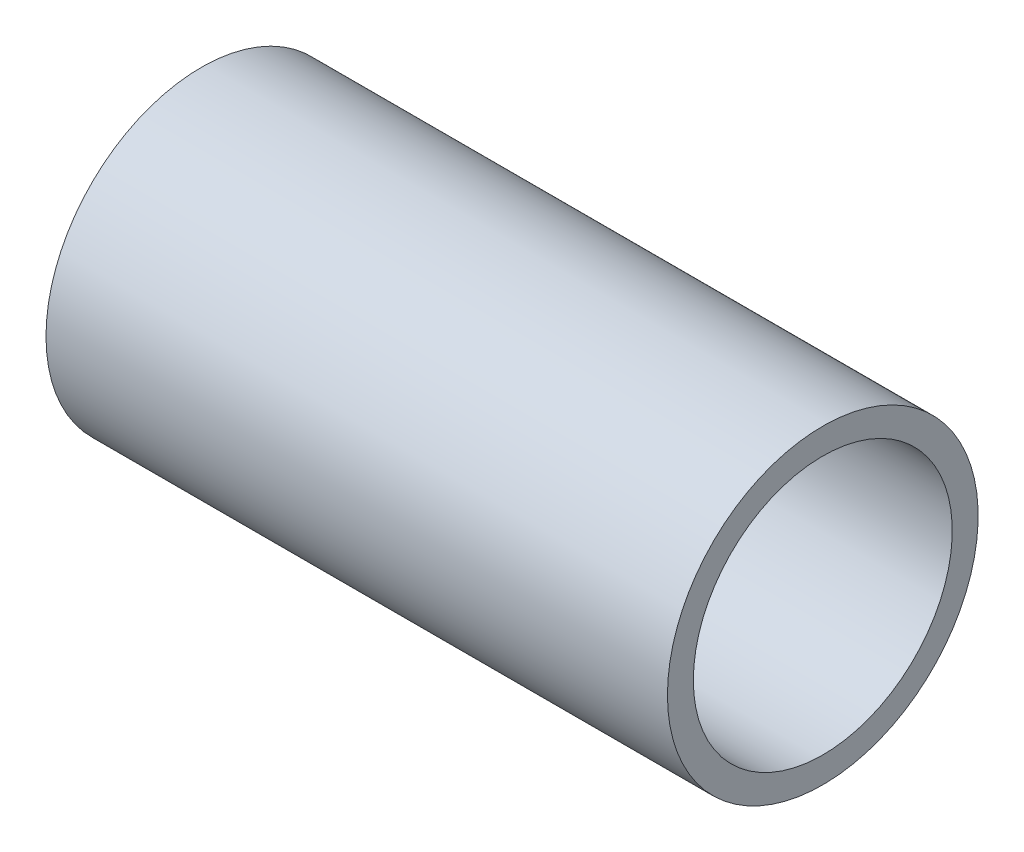
ISO-10303-21;
HEADER;
FILE_DESCRIPTION(('STEP AP214'),'2;1');
FILE_NAME('part.step','',(''),(''),'','','');
FILE_SCHEMA(('AUTOMOTIVE_DESIGN { 1 0 10303 214 1 1 1 1 }'));
ENDSEC;
DATA;
#1=APPLICATION_CONTEXT('core data for automotive mechanical design processes');
#2=APPLICATION_PROTOCOL_DEFINITION('international standard','automotive_design',2000,#1);
#3=PRODUCT_CONTEXT('',#1,'mechanical');
#4=PRODUCT('Part','Part','',(#3));
#5=PRODUCT_RELATED_PRODUCT_CATEGORY('part','',(#4));
#6=PRODUCT_DEFINITION_FORMATION('','',#4);
#7=PRODUCT_DEFINITION_CONTEXT('part definition',#1,'design');
#8=PRODUCT_DEFINITION('design','',#6,#7);
#9=PRODUCT_DEFINITION_SHAPE('','',#8);
#10=(LENGTH_UNIT() NAMED_UNIT(*) SI_UNIT(.MILLI.,.METRE.));
#11=(NAMED_UNIT(*) PLANE_ANGLE_UNIT() SI_UNIT($,.RADIAN.));
#12=(NAMED_UNIT(*) SI_UNIT($,.STERADIAN.) SOLID_ANGLE_UNIT());
#13=UNCERTAINTY_MEASURE_WITH_UNIT(LENGTH_MEASURE(1.E-05),#10,'distance_accuracy_value','');
#14=(GEOMETRIC_REPRESENTATION_CONTEXT(3) GLOBAL_UNCERTAINTY_ASSIGNED_CONTEXT((#13)) GLOBAL_UNIT_ASSIGNED_CONTEXT((#10,
#11,#12)) REPRESENTATION_CONTEXT('',''));
#15=CARTESIAN_POINT('',(0.,0.,0.));
#16=DIRECTION('',(0.,0.,1.));
#17=DIRECTION('',(1.,0.,0.));
#18=AXIS2_PLACEMENT_3D('',#15,#16,#17);
#19=CARTESIAN_POINT('',(7.62,0.,0.));
#20=DIRECTION('',(1.,0.,0.));
#21=DIRECTION('',(0.,0.,-1.));
#22=AXIS2_PLACEMENT_3D('',#19,#20,#21);
#23=PLANE('',#22);
#24=CARTESIAN_POINT('',(7.62,0.,0.));
#25=DIRECTION('',(1.,0.,0.));
#26=DIRECTION('',(0.,0.,-1.));
#27=AXIS2_PLACEMENT_3D('',#24,#25,#26);
#28=CIRCLE('',#27,1.905);
#29=CARTESIAN_POINT('',(7.62,0.,1.905));
#30=VERTEX_POINT('',#29);
#31=EDGE_CURVE('E10',#30,#30,#28,.T.);
#32=ORIENTED_EDGE('',*,*,#31,.T.);
#33=EDGE_LOOP('',(#32));
#34=FACE_BOUND('',#33,.T.);
#35=CARTESIAN_POINT('',(7.62,0.,0.));
#36=DIRECTION('',(1.,0.,0.));
#37=DIRECTION('',(0.,0.,-1.));
#38=AXIS2_PLACEMENT_3D('',#35,#36,#37);
#39=CIRCLE('',#38,1.5875);
#40=CARTESIAN_POINT('',(7.62,0.,1.5875));
#41=VERTEX_POINT('',#40);
#42=EDGE_CURVE('E41',#41,#41,#39,.T.);
#43=ORIENTED_EDGE('',*,*,#42,.F.);
#44=EDGE_LOOP('',(#43));
#45=FACE_BOUND('',#44,.T.);
#46=ADVANCED_FACE('F30',(#34,#45),#23,.T.);
#47=CARTESIAN_POINT('',(0.,0.,0.));
#48=DIRECTION('',(1.,0.,0.));
#49=DIRECTION('',(0.,0.,-1.));
#50=AXIS2_PLACEMENT_3D('',#47,#48,#49);
#51=PLANE('',#50);
#52=CARTESIAN_POINT('',(0.,0.,0.));
#53=DIRECTION('',(1.,0.,0.));
#54=DIRECTION('',(0.,0.,-1.));
#55=AXIS2_PLACEMENT_3D('',#52,#53,#54);
#56=CIRCLE('',#55,1.905);
#57=CARTESIAN_POINT('',(0.,0.,1.905));
#58=VERTEX_POINT('',#57);
#59=EDGE_CURVE('E34',#58,#58,#56,.T.);
#60=ORIENTED_EDGE('',*,*,#59,.F.);
#61=EDGE_LOOP('',(#60));
#62=FACE_BOUND('',#61,.T.);
#63=CARTESIAN_POINT('',(0.,0.,0.));
#64=DIRECTION('',(1.,0.,0.));
#65=DIRECTION('',(0.,0.,-1.));
#66=AXIS2_PLACEMENT_3D('',#63,#64,#65);
#67=CIRCLE('',#66,1.5875);
#68=CARTESIAN_POINT('',(0.,0.,1.5875));
#69=VERTEX_POINT('',#68);
#70=EDGE_CURVE('E43',#69,#69,#67,.T.);
#71=ORIENTED_EDGE('',*,*,#70,.T.);
#72=EDGE_LOOP('',(#71));
#73=FACE_BOUND('',#72,.T.);
#74=ADVANCED_FACE('F53',(#62,#73),#51,.F.);
#75=CARTESIAN_POINT('',(7.62,0.,0.));
#76=DIRECTION('',(-1.,0.,0.));
#77=DIRECTION('',(0.,0.,1.));
#78=AXIS2_PLACEMENT_3D('',#75,#76,#77);
#79=CYLINDRICAL_SURFACE('',#78,1.905);
#80=CARTESIAN_POINT('',(7.62,0.,1.905));
#81=CARTESIAN_POINT('',(7.540625,0.,1.905));
#82=CARTESIAN_POINT('',(7.46125,0.,1.905));
#83=CARTESIAN_POINT('',(7.3025,0.,1.905));
#84=CARTESIAN_POINT('',(7.223125,0.,1.905));
#85=CARTESIAN_POINT('',(7.064375,0.,1.905));
#86=CARTESIAN_POINT('',(6.985,0.,1.905));
#87=CARTESIAN_POINT('',(6.82625,0.,1.905));
#88=CARTESIAN_POINT('',(6.746875,0.,1.905));
#89=CARTESIAN_POINT('',(6.588125,0.,1.905));
#90=CARTESIAN_POINT('',(6.50875,0.,1.905));
#91=CARTESIAN_POINT('',(6.35,0.,1.905));
#92=CARTESIAN_POINT('',(6.270625,0.,1.905));
#93=CARTESIAN_POINT('',(6.111875,0.,1.905));
#94=CARTESIAN_POINT('',(6.0325,0.,1.905));
#95=CARTESIAN_POINT('',(5.87375,0.,1.905));
#96=CARTESIAN_POINT('',(5.794375,0.,1.905));
#97=CARTESIAN_POINT('',(5.635625,0.,1.905));
#98=CARTESIAN_POINT('',(5.55625,0.,1.905));
#99=CARTESIAN_POINT('',(5.3975,0.,1.905));
#100=CARTESIAN_POINT('',(5.318125,0.,1.905));
#101=CARTESIAN_POINT('',(5.159375,0.,1.905));
#102=CARTESIAN_POINT('',(5.08,0.,1.905));
#103=CARTESIAN_POINT('',(4.92125,0.,1.905));
#104=CARTESIAN_POINT('',(4.841875,0.,1.905));
#105=CARTESIAN_POINT('',(4.683125,0.,1.905));
#106=CARTESIAN_POINT('',(4.60375,0.,1.905));
#107=CARTESIAN_POINT('',(4.445,0.,1.905));
#108=CARTESIAN_POINT('',(4.365625,0.,1.905));
#109=CARTESIAN_POINT('',(4.206875,0.,1.905));
#110=CARTESIAN_POINT('',(4.1275,0.,1.905));
#111=CARTESIAN_POINT('',(3.96875,0.,1.905));
#112=CARTESIAN_POINT('',(3.889375,0.,1.905));
#113=CARTESIAN_POINT('',(3.730625,0.,1.905));
#114=CARTESIAN_POINT('',(3.65125,0.,1.905));
#115=CARTESIAN_POINT('',(3.4925,0.,1.905));
#116=CARTESIAN_POINT('',(3.413125,0.,1.905));
#117=CARTESIAN_POINT('',(3.254375,0.,1.905));
#118=CARTESIAN_POINT('',(3.175,0.,1.905));
#119=CARTESIAN_POINT('',(3.01625,0.,1.905));
#120=CARTESIAN_POINT('',(2.936875,0.,1.905));
#121=CARTESIAN_POINT('',(2.778125,0.,1.905));
#122=CARTESIAN_POINT('',(2.69875,0.,1.905));
#123=CARTESIAN_POINT('',(2.54,0.,1.905));
#124=CARTESIAN_POINT('',(2.460625,0.,1.905));
#125=CARTESIAN_POINT('',(2.301875,0.,1.905));
#126=CARTESIAN_POINT('',(2.2225,0.,1.905));
#127=CARTESIAN_POINT('',(2.06375,0.,1.905));
#128=CARTESIAN_POINT('',(1.984375,0.,1.905));
#129=CARTESIAN_POINT('',(1.825625,0.,1.905));
#130=CARTESIAN_POINT('',(1.74625,0.,1.905));
#131=CARTESIAN_POINT('',(1.5875,0.,1.905));
#132=CARTESIAN_POINT('',(1.508125,0.,1.905));
#133=CARTESIAN_POINT('',(1.349375,0.,1.905));
#134=CARTESIAN_POINT('',(1.27,0.,1.905));
#135=CARTESIAN_POINT('',(1.11125,0.,1.905));
#136=CARTESIAN_POINT('',(1.031875,0.,1.905));
#137=CARTESIAN_POINT('',(0.873125,0.,1.905));
#138=CARTESIAN_POINT('',(0.79375,0.,1.905));
#139=CARTESIAN_POINT('',(0.635,0.,1.905));
#140=CARTESIAN_POINT('',(0.555625,0.,1.905));
#141=CARTESIAN_POINT('',(0.396875,0.,1.905));
#142=CARTESIAN_POINT('',(0.3175,0.,1.905));
#143=CARTESIAN_POINT('',(0.15875,0.,1.905));
#144=CARTESIAN_POINT('',(0.0793749999999999,0.,1.905));
#145=CARTESIAN_POINT('',(0.,0.,1.905));
#146=B_SPLINE_CURVE_WITH_KNOTS('',3,(#80,#81,#82,#83,#84,#85,#86,#87,#88,#89,#90,#91,#92,#93,
#94,#95,#96,#97,#98,#99,#100,#101,#102,#103,#104,#105,#106,#107,#108,#109,#110,#111,#112,#113,
#114,#115,#116,#117,#118,#119,#120,#121,#122,#123,#124,#125,#126,#127,#128,#129,#130,#131,#132,
#133,#134,#135,#136,#137,#138,#139,#140,#141,#142,#143,#144,#145),.UNSPECIFIED.,.F.,.F.,(4,2,2,
2,2,2,2,2,2,2,2,2,2,2,2,2,2,2,2,2,2,2,2,2,2,2,2,2,2,2,2,2,4),(0.,0.238125,0.47625,
0.714375000000001,0.9525,1.190625,1.42875,1.666875,1.905,2.143125,2.38125,2.619375,2.8575,
3.095625,3.33375,3.571875,3.81,4.048125,4.28625,4.524375,4.7625,5.000625,5.23875,5.476875,5.715,
5.953125,6.19125,6.429375,6.6675,6.905625,7.14375,7.381875,7.62),.UNSPECIFIED.);
#147=EDGE_CURVE('BSEAM32',#30,#58,#146,.T.);
#148=ORIENTED_EDGE('',*,*,#31,.F.);
#149=ORIENTED_EDGE('',*,*,#59,.T.);
#150=ORIENTED_EDGE('',*,*,#147,.T.);
#151=ORIENTED_EDGE('',*,*,#147,.F.);
#152=EDGE_LOOP('',(#148,#150,#149,#151));
#153=FACE_BOUND('',#152,.T.);
#154=ADVANCED_FACE('F32',(#153),#79,.T.);
#155=CARTESIAN_POINT('',(7.62,0.,0.));
#156=DIRECTION('',(-1.,0.,0.));
#157=DIRECTION('',(0.,0.,1.));
#158=AXIS2_PLACEMENT_3D('',#155,#156,#157);
#159=CYLINDRICAL_SURFACE('',#158,1.5875);
#160=CARTESIAN_POINT('',(7.62,0.,1.5875));
#161=CARTESIAN_POINT('',(7.540625,0.,1.5875));
#162=CARTESIAN_POINT('',(7.46125,0.,1.5875));
#163=CARTESIAN_POINT('',(7.3025,0.,1.5875));
#164=CARTESIAN_POINT('',(7.223125,0.,1.5875));
#165=CARTESIAN_POINT('',(7.064375,0.,1.5875));
#166=CARTESIAN_POINT('',(6.985,0.,1.5875));
#167=CARTESIAN_POINT('',(6.82625,0.,1.5875));
#168=CARTESIAN_POINT('',(6.746875,0.,1.5875));
#169=CARTESIAN_POINT('',(6.588125,0.,1.5875));
#170=CARTESIAN_POINT('',(6.50875,0.,1.5875));
#171=CARTESIAN_POINT('',(6.35,0.,1.5875));
#172=CARTESIAN_POINT('',(6.270625,0.,1.5875));
#173=CARTESIAN_POINT('',(6.111875,0.,1.5875));
#174=CARTESIAN_POINT('',(6.0325,0.,1.5875));
#175=CARTESIAN_POINT('',(5.87375,0.,1.5875));
#176=CARTESIAN_POINT('',(5.794375,0.,1.5875));
#177=CARTESIAN_POINT('',(5.635625,0.,1.5875));
#178=CARTESIAN_POINT('',(5.55625,0.,1.5875));
#179=CARTESIAN_POINT('',(5.3975,0.,1.5875));
#180=CARTESIAN_POINT('',(5.318125,0.,1.5875));
#181=CARTESIAN_POINT('',(5.159375,0.,1.5875));
#182=CARTESIAN_POINT('',(5.08,0.,1.5875));
#183=CARTESIAN_POINT('',(4.92125,0.,1.5875));
#184=CARTESIAN_POINT('',(4.841875,0.,1.5875));
#185=CARTESIAN_POINT('',(4.683125,0.,1.5875));
#186=CARTESIAN_POINT('',(4.60375,0.,1.5875));
#187=CARTESIAN_POINT('',(4.445,0.,1.5875));
#188=CARTESIAN_POINT('',(4.365625,0.,1.5875));
#189=CARTESIAN_POINT('',(4.206875,0.,1.5875));
#190=CARTESIAN_POINT('',(4.1275,0.,1.5875));
#191=CARTESIAN_POINT('',(3.96875,0.,1.5875));
#192=CARTESIAN_POINT('',(3.889375,0.,1.5875));
#193=CARTESIAN_POINT('',(3.730625,0.,1.5875));
#194=CARTESIAN_POINT('',(3.65125,0.,1.5875));
#195=CARTESIAN_POINT('',(3.4925,0.,1.5875));
#196=CARTESIAN_POINT('',(3.413125,0.,1.5875));
#197=CARTESIAN_POINT('',(3.254375,0.,1.5875));
#198=CARTESIAN_POINT('',(3.175,0.,1.5875));
#199=CARTESIAN_POINT('',(3.01625,0.,1.5875));
#200=CARTESIAN_POINT('',(2.936875,0.,1.5875));
#201=CARTESIAN_POINT('',(2.778125,0.,1.5875));
#202=CARTESIAN_POINT('',(2.69875,0.,1.5875));
#203=CARTESIAN_POINT('',(2.54,0.,1.5875));
#204=CARTESIAN_POINT('',(2.460625,0.,1.5875));
#205=CARTESIAN_POINT('',(2.301875,0.,1.5875));
#206=CARTESIAN_POINT('',(2.2225,0.,1.5875));
#207=CARTESIAN_POINT('',(2.06375,0.,1.5875));
#208=CARTESIAN_POINT('',(1.984375,0.,1.5875));
#209=CARTESIAN_POINT('',(1.825625,0.,1.5875));
#210=CARTESIAN_POINT('',(1.74625,0.,1.5875));
#211=CARTESIAN_POINT('',(1.5875,0.,1.5875));
#212=CARTESIAN_POINT('',(1.508125,0.,1.5875));
#213=CARTESIAN_POINT('',(1.349375,0.,1.5875));
#214=CARTESIAN_POINT('',(1.27,0.,1.5875));
#215=CARTESIAN_POINT('',(1.11125,0.,1.5875));
#216=CARTESIAN_POINT('',(1.031875,0.,1.5875));
#217=CARTESIAN_POINT('',(0.873125,0.,1.5875));
#218=CARTESIAN_POINT('',(0.79375,0.,1.5875));
#219=CARTESIAN_POINT('',(0.635,0.,1.5875));
#220=CARTESIAN_POINT('',(0.555625,0.,1.5875));
#221=CARTESIAN_POINT('',(0.396875,0.,1.5875));
#222=CARTESIAN_POINT('',(0.3175,0.,1.5875));
#223=CARTESIAN_POINT('',(0.15875,0.,1.5875));
#224=CARTESIAN_POINT('',(0.0793749999999999,0.,1.5875));
#225=CARTESIAN_POINT('',(0.,0.,1.5875));
#226=B_SPLINE_CURVE_WITH_KNOTS('',3,(#160,#161,#162,#163,#164,#165,#166,#167,#168,#169,#170,
#171,#172,#173,#174,#175,#176,#177,#178,#179,#180,#181,#182,#183,#184,#185,#186,#187,#188,#189,
#190,#191,#192,#193,#194,#195,#196,#197,#198,#199,#200,#201,#202,#203,#204,#205,#206,#207,#208,
#209,#210,#211,#212,#213,#214,#215,#216,#217,#218,#219,#220,#221,#222,#223,#224,#225),
.UNSPECIFIED.,.F.,.F.,(4,2,2,2,2,2,2,2,2,2,2,2,2,2,2,2,2,2,2,2,2,2,2,2,2,2,2,2,2,2,2,2,4),(0.,
0.238125,0.476249999999999,0.714375,0.952499999999999,1.190625,1.42875,1.666875,1.905,2.143125,
2.38125,2.619375,2.8575,3.095625,3.33375,3.571875,3.81,4.048125,4.28625,4.524375,4.7625,
5.000625,5.23875,5.476875,5.715,5.953125,6.19125,6.429375,6.6675,6.905625,7.14375,7.381875,
7.62),.UNSPECIFIED.);
#227=EDGE_CURVE('BSEAM49',#41,#69,#226,.T.);
#228=ORIENTED_EDGE('',*,*,#42,.T.);
#229=ORIENTED_EDGE('',*,*,#70,.F.);
#230=ORIENTED_EDGE('',*,*,#227,.T.);
#231=ORIENTED_EDGE('',*,*,#227,.F.);
#232=EDGE_LOOP('',(#228,#230,#229,#231));
#233=FACE_BOUND('',#232,.T.);
#234=ADVANCED_FACE('F49',(#233),#159,.F.);
#235=CLOSED_SHELL('',(#46,#74,#154,#234));
#236=MANIFOLD_SOLID_BREP('B2',#235);
#237=ADVANCED_BREP_SHAPE_REPRESENTATION('',(#18,#236),#14);
#238=SHAPE_DEFINITION_REPRESENTATION(#9,#237);
ENDSEC;
END-ISO-10303-21;
